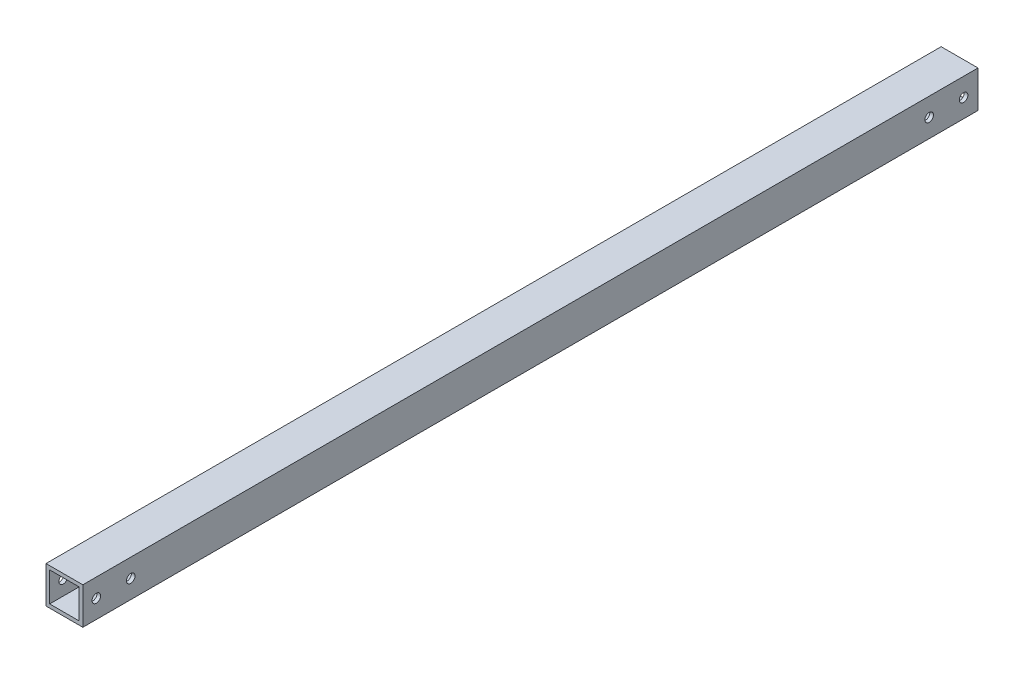
ISO-10303-21;
HEADER;
FILE_DESCRIPTION(('STEP AP214'),'2;1');
FILE_NAME('part.step','',(''),(''),'','','');
FILE_SCHEMA(('AUTOMOTIVE_DESIGN { 1 0 10303 214 1 1 1 1 }'));
ENDSEC;
DATA;
#1=APPLICATION_CONTEXT('core data for automotive mechanical design processes');
#2=APPLICATION_PROTOCOL_DEFINITION('international standard','automotive_design',2000,#1);
#3=PRODUCT_CONTEXT('',#1,'mechanical');
#4=PRODUCT('Part','Part','',(#3));
#5=PRODUCT_RELATED_PRODUCT_CATEGORY('part','',(#4));
#6=PRODUCT_DEFINITION_FORMATION('','',#4);
#7=PRODUCT_DEFINITION_CONTEXT('part definition',#1,'design');
#8=PRODUCT_DEFINITION('design','',#6,#7);
#9=PRODUCT_DEFINITION_SHAPE('','',#8);
#10=(LENGTH_UNIT() NAMED_UNIT(*) SI_UNIT(.MILLI.,.METRE.));
#11=(NAMED_UNIT(*) PLANE_ANGLE_UNIT() SI_UNIT($,.RADIAN.));
#12=(NAMED_UNIT(*) SI_UNIT($,.STERADIAN.) SOLID_ANGLE_UNIT());
#13=UNCERTAINTY_MEASURE_WITH_UNIT(LENGTH_MEASURE(1.E-05),#10,'distance_accuracy_value','');
#14=(GEOMETRIC_REPRESENTATION_CONTEXT(3) GLOBAL_UNCERTAINTY_ASSIGNED_CONTEXT((#13)) GLOBAL_UNIT_ASSIGNED_CONTEXT((#10,
#11,#12)) REPRESENTATION_CONTEXT('',''));
#15=CARTESIAN_POINT('',(0.,0.,0.));
#16=DIRECTION('',(0.,0.,1.));
#17=DIRECTION('',(1.,0.,0.));
#18=AXIS2_PLACEMENT_3D('',#15,#16,#17);
#19=CARTESIAN_POINT('',(0.,-30.,729.));
#20=DIRECTION('',(0.,0.,1.));
#21=DIRECTION('',(1.,0.,0.));
#22=AXIS2_PLACEMENT_3D('',#19,#20,#21);
#23=PLANE('',#22);
#24=DIRECTION('',(0.,-1.,0.));
#25=VECTOR('',#24,1.);
#26=CARTESIAN_POINT('',(0.,0.,729.));
#27=LINE('',#26,#25);
#28=CARTESIAN_POINT('',(0.,0.,729.));
#29=VERTEX_POINT('',#28);
#30=CARTESIAN_POINT('',(0.,-30.,729.));
#31=VERTEX_POINT('',#30);
#32=EDGE_CURVE('E139',#29,#31,#27,.T.);
#33=ORIENTED_EDGE('',*,*,#32,.T.);
#34=DIRECTION('',(1.,0.,0.));
#35=VECTOR('',#34,1.);
#36=CARTESIAN_POINT('',(0.,-30.,729.));
#37=LINE('',#36,#35);
#38=CARTESIAN_POINT('',(30.,-30.,729.));
#39=VERTEX_POINT('',#38);
#40=EDGE_CURVE('E142',#31,#39,#37,.T.);
#41=ORIENTED_EDGE('',*,*,#40,.T.);
#42=DIRECTION('',(0.,1.,0.));
#43=VECTOR('',#42,1.);
#44=CARTESIAN_POINT('',(30.,0.,729.));
#45=LINE('',#44,#43);
#46=CARTESIAN_POINT('',(30.,0.,729.));
#47=VERTEX_POINT('',#46);
#48=EDGE_CURVE('E145',#39,#47,#45,.T.);
#49=ORIENTED_EDGE('',*,*,#48,.T.);
#50=DIRECTION('',(-1.,0.,0.));
#51=VECTOR('',#50,1.);
#52=CARTESIAN_POINT('',(0.,0.,729.));
#53=LINE('',#52,#51);
#54=EDGE_CURVE('E147',#47,#29,#53,.T.);
#55=ORIENTED_EDGE('',*,*,#54,.T.);
#56=EDGE_LOOP('',(#33,#41,#49,#55));
#57=FACE_BOUND('',#56,.T.);
#58=DIRECTION('',(1.,0.,0.));
#59=VECTOR('',#58,1.);
#60=CARTESIAN_POINT('',(3.,-27.,729.));
#61=LINE('',#60,#59);
#62=CARTESIAN_POINT('',(3.,-27.,729.));
#63=VERTEX_POINT('',#62);
#64=CARTESIAN_POINT('',(27.,-27.,729.));
#65=VERTEX_POINT('',#64);
#66=EDGE_CURVE('E109',#63,#65,#61,.T.);
#67=ORIENTED_EDGE('',*,*,#66,.F.);
#68=DIRECTION('',(0.,-1.,0.));
#69=VECTOR('',#68,1.);
#70=CARTESIAN_POINT('',(3.,-3.,729.));
#71=LINE('',#70,#69);
#72=CARTESIAN_POINT('',(3.,-3.,729.));
#73=VERTEX_POINT('',#72);
#74=EDGE_CURVE('E101',#73,#63,#71,.T.);
#75=ORIENTED_EDGE('',*,*,#74,.F.);
#76=DIRECTION('',(-1.,0.,0.));
#77=VECTOR('',#76,1.);
#78=CARTESIAN_POINT('',(3.,-3.,729.));
#79=LINE('',#78,#77);
#80=CARTESIAN_POINT('',(27.,-3.,729.));
#81=VERTEX_POINT('',#80);
#82=EDGE_CURVE('E123',#81,#73,#79,.T.);
#83=ORIENTED_EDGE('',*,*,#82,.F.);
#84=DIRECTION('',(0.,1.,0.));
#85=VECTOR('',#84,1.);
#86=CARTESIAN_POINT('',(27.,-3.,729.));
#87=LINE('',#86,#85);
#88=EDGE_CURVE('E121',#65,#81,#87,.T.);
#89=ORIENTED_EDGE('',*,*,#88,.F.);
#90=EDGE_LOOP('',(#67,#75,#83,#89));
#91=FACE_BOUND('',#90,.T.);
#92=ADVANCED_FACE('F34',(#57,#91),#23,.T.);
#93=CARTESIAN_POINT('',(0.,-30.,0.));
#94=DIRECTION('',(0.,0.,1.));
#95=DIRECTION('',(1.,0.,0.));
#96=AXIS2_PLACEMENT_3D('',#93,#94,#95);
#97=PLANE('',#96);
#98=DIRECTION('',(0.,-1.,0.));
#99=VECTOR('',#98,1.);
#100=CARTESIAN_POINT('',(0.,0.,0.));
#101=LINE('',#100,#99);
#102=CARTESIAN_POINT('',(0.,0.,0.));
#103=VERTEX_POINT('',#102);
#104=CARTESIAN_POINT('',(0.,-30.,0.));
#105=VERTEX_POINT('',#104);
#106=EDGE_CURVE('E117',#103,#105,#101,.T.);
#107=ORIENTED_EDGE('',*,*,#106,.F.);
#108=DIRECTION('',(-1.,0.,0.));
#109=VECTOR('',#108,1.);
#110=CARTESIAN_POINT('',(0.,0.,0.));
#111=LINE('',#110,#109);
#112=CARTESIAN_POINT('',(30.,0.,0.));
#113=VERTEX_POINT('',#112);
#114=EDGE_CURVE('E143',#113,#103,#111,.T.);
#115=ORIENTED_EDGE('',*,*,#114,.F.);
#116=DIRECTION('',(0.,1.,0.));
#117=VECTOR('',#116,1.);
#118=CARTESIAN_POINT('',(30.,0.,0.));
#119=LINE('',#118,#117);
#120=CARTESIAN_POINT('',(30.,-30.,0.));
#121=VERTEX_POINT('',#120);
#122=EDGE_CURVE('E154',#121,#113,#119,.T.);
#123=ORIENTED_EDGE('',*,*,#122,.F.);
#124=DIRECTION('',(1.,0.,0.));
#125=VECTOR('',#124,1.);
#126=CARTESIAN_POINT('',(0.,-30.,0.));
#127=LINE('',#126,#125);
#128=EDGE_CURVE('E152',#105,#121,#127,.T.);
#129=ORIENTED_EDGE('',*,*,#128,.F.);
#130=EDGE_LOOP('',(#107,#115,#123,#129));
#131=FACE_BOUND('',#130,.T.);
#132=DIRECTION('',(0.,-1.,0.));
#133=VECTOR('',#132,1.);
#134=CARTESIAN_POINT('',(3.,-3.,0.));
#135=LINE('',#134,#133);
#136=CARTESIAN_POINT('',(3.,-3.,0.));
#137=VERTEX_POINT('',#136);
#138=CARTESIAN_POINT('',(3.,-27.,0.));
#139=VERTEX_POINT('',#138);
#140=EDGE_CURVE('E59',#137,#139,#135,.T.);
#141=ORIENTED_EDGE('',*,*,#140,.T.);
#142=DIRECTION('',(1.,0.,0.));
#143=VECTOR('',#142,1.);
#144=CARTESIAN_POINT('',(3.,-27.,0.));
#145=LINE('',#144,#143);
#146=CARTESIAN_POINT('',(27.,-27.,0.));
#147=VERTEX_POINT('',#146);
#148=EDGE_CURVE('E116',#139,#147,#145,.T.);
#149=ORIENTED_EDGE('',*,*,#148,.T.);
#150=DIRECTION('',(0.,1.,0.));
#151=VECTOR('',#150,1.);
#152=CARTESIAN_POINT('',(27.,-3.,0.));
#153=LINE('',#152,#151);
#154=CARTESIAN_POINT('',(27.,-3.,0.));
#155=VERTEX_POINT('',#154);
#156=EDGE_CURVE('E131',#147,#155,#153,.T.);
#157=ORIENTED_EDGE('',*,*,#156,.T.);
#158=DIRECTION('',(-1.,0.,0.));
#159=VECTOR('',#158,1.);
#160=CARTESIAN_POINT('',(3.,-3.,0.));
#161=LINE('',#160,#159);
#162=EDGE_CURVE('E110',#155,#137,#161,.T.);
#163=ORIENTED_EDGE('',*,*,#162,.T.);
#164=EDGE_LOOP('',(#141,#149,#157,#163));
#165=FACE_BOUND('',#164,.T.);
#166=ADVANCED_FACE('F227',(#131,#165),#97,.F.);
#167=CARTESIAN_POINT('',(0.,0.,729.));
#168=DIRECTION('',(1.,0.,0.));
#169=DIRECTION('',(0.,1.,0.));
#170=AXIS2_PLACEMENT_3D('',#167,#168,#169);
#171=PLANE('',#170);
#172=CARTESIAN_POINT('',(0.,-14.9999999999987,11.7500000000004));
#173=DIRECTION('',(1.,0.,0.));
#174=DIRECTION('',(0.,0.,-1.));
#175=AXIS2_PLACEMENT_3D('',#172,#173,#174);
#176=CIRCLE('',#175,3.49999999999999);
#177=CARTESIAN_POINT('',(0.,-14.9999999999987,8.25000000000038));
#178=VERTEX_POINT('',#177);
#179=EDGE_CURVE('E198',#178,#178,#176,.T.);
#180=ORIENTED_EDGE('',*,*,#179,.T.);
#181=EDGE_LOOP('',(#180));
#182=FACE_BOUND('',#181,.T.);
#183=CARTESIAN_POINT('',(0.,-14.9999999999987,39.7500000000003));
#184=DIRECTION('',(1.,0.,0.));
#185=DIRECTION('',(0.,0.,-1.));
#186=AXIS2_PLACEMENT_3D('',#183,#184,#185);
#187=CIRCLE('',#186,3.49999999999999);
#188=CARTESIAN_POINT('',(0.,-14.9999999999987,36.2500000000003));
#189=VERTEX_POINT('',#188);
#190=EDGE_CURVE('E186',#189,#189,#187,.T.);
#191=ORIENTED_EDGE('',*,*,#190,.T.);
#192=EDGE_LOOP('',(#191));
#193=FACE_BOUND('',#192,.T.);
#194=CARTESIAN_POINT('',(0.,-14.9999999999987,718.));
#195=DIRECTION('',(1.,0.,0.));
#196=DIRECTION('',(0.,0.,-1.));
#197=AXIS2_PLACEMENT_3D('',#194,#195,#196);
#198=CIRCLE('',#197,3.49999999999999);
#199=CARTESIAN_POINT('',(0.,-14.9999999999987,714.5));
#200=VERTEX_POINT('',#199);
#201=EDGE_CURVE('E180',#200,#200,#198,.T.);
#202=ORIENTED_EDGE('',*,*,#201,.T.);
#203=EDGE_LOOP('',(#202));
#204=FACE_BOUND('',#203,.T.);
#205=CARTESIAN_POINT('',(0.,-14.9999999999987,690.));
#206=DIRECTION('',(1.,0.,0.));
#207=DIRECTION('',(0.,0.,-1.));
#208=AXIS2_PLACEMENT_3D('',#205,#206,#207);
#209=CIRCLE('',#208,3.49999999999999);
#210=CARTESIAN_POINT('',(0.,-14.9999999999987,686.5));
#211=VERTEX_POINT('',#210);
#212=EDGE_CURVE('E165',#211,#211,#209,.T.);
#213=ORIENTED_EDGE('',*,*,#212,.T.);
#214=EDGE_LOOP('',(#213));
#215=FACE_BOUND('',#214,.T.);
#216=ORIENTED_EDGE('',*,*,#106,.T.);
#217=DIRECTION('',(0.,0.,-1.));
#218=VECTOR('',#217,1.);
#219=CARTESIAN_POINT('',(0.,-30.,729.));
#220=LINE('',#219,#218);
#221=EDGE_CURVE('E11',#31,#105,#220,.T.);
#222=ORIENTED_EDGE('',*,*,#221,.F.);
#223=ORIENTED_EDGE('',*,*,#32,.F.);
#224=DIRECTION('',(0.,0.,-1.));
#225=VECTOR('',#224,1.);
#226=CARTESIAN_POINT('',(0.,0.,729.));
#227=LINE('',#226,#225);
#228=EDGE_CURVE('E149',#29,#103,#227,.T.);
#229=ORIENTED_EDGE('',*,*,#228,.T.);
#230=EDGE_LOOP('',(#216,#222,#223,#229));
#231=FACE_BOUND('',#230,.T.);
#232=ADVANCED_FACE('F36',(#182,#193,#204,#215,#231),#171,.F.);
#233=CARTESIAN_POINT('',(0.,-30.,729.));
#234=DIRECTION('',(0.,1.,0.));
#235=DIRECTION('',(0.,0.,1.));
#236=AXIS2_PLACEMENT_3D('',#233,#234,#235);
#237=PLANE('',#236);
#238=ORIENTED_EDGE('',*,*,#128,.T.);
#239=DIRECTION('',(0.,0.,-1.));
#240=VECTOR('',#239,1.);
#241=CARTESIAN_POINT('',(30.,-30.,729.));
#242=LINE('',#241,#240);
#243=EDGE_CURVE('E43',#39,#121,#242,.T.);
#244=ORIENTED_EDGE('',*,*,#243,.F.);
#245=ORIENTED_EDGE('',*,*,#40,.F.);
#246=ORIENTED_EDGE('',*,*,#221,.T.);
#247=EDGE_LOOP('',(#238,#244,#245,#246));
#248=FACE_BOUND('',#247,.T.);
#249=ADVANCED_FACE('F254',(#248),#237,.F.);
#250=CARTESIAN_POINT('',(30.,0.,729.));
#251=DIRECTION('',(-1.,0.,0.));
#252=DIRECTION('',(0.,-1.,0.));
#253=AXIS2_PLACEMENT_3D('',#250,#251,#252);
#254=PLANE('',#253);
#255=CARTESIAN_POINT('',(30.,-14.9999999999987,39.7500000000003));
#256=DIRECTION('',(1.,0.,0.));
#257=DIRECTION('',(0.,0.,-1.));
#258=AXIS2_PLACEMENT_3D('',#255,#256,#257);
#259=CIRCLE('',#258,3.5);
#260=CARTESIAN_POINT('',(30.,-14.9999999999987,36.2500000000003));
#261=VERTEX_POINT('',#260);
#262=EDGE_CURVE('E204',#261,#261,#259,.T.);
#263=ORIENTED_EDGE('',*,*,#262,.F.);
#264=EDGE_LOOP('',(#263));
#265=FACE_BOUND('',#264,.T.);
#266=CARTESIAN_POINT('',(30.,-14.9999999999987,11.7500000000004));
#267=DIRECTION('',(1.,0.,0.));
#268=DIRECTION('',(0.,0.,-1.));
#269=AXIS2_PLACEMENT_3D('',#266,#267,#268);
#270=CIRCLE('',#269,3.5);
#271=CARTESIAN_POINT('',(30.,-14.9999999999987,8.25000000000037));
#272=VERTEX_POINT('',#271);
#273=EDGE_CURVE('E192',#272,#272,#270,.T.);
#274=ORIENTED_EDGE('',*,*,#273,.F.);
#275=EDGE_LOOP('',(#274));
#276=FACE_BOUND('',#275,.T.);
#277=CARTESIAN_POINT('',(30.,-14.9999999999987,718.));
#278=DIRECTION('',(1.,0.,0.));
#279=DIRECTION('',(0.,0.,-1.));
#280=AXIS2_PLACEMENT_3D('',#277,#278,#279);
#281=CIRCLE('',#280,3.5);
#282=CARTESIAN_POINT('',(30.,-14.9999999999987,714.5));
#283=VERTEX_POINT('',#282);
#284=EDGE_CURVE('E183',#283,#283,#281,.T.);
#285=ORIENTED_EDGE('',*,*,#284,.F.);
#286=EDGE_LOOP('',(#285));
#287=FACE_BOUND('',#286,.T.);
#288=CARTESIAN_POINT('',(30.,-14.9999999999987,690.));
#289=DIRECTION('',(1.,0.,0.));
#290=DIRECTION('',(0.,0.,-1.));
#291=AXIS2_PLACEMENT_3D('',#288,#289,#290);
#292=CIRCLE('',#291,3.5);
#293=CARTESIAN_POINT('',(30.,-14.9999999999987,686.5));
#294=VERTEX_POINT('',#293);
#295=EDGE_CURVE('E170',#294,#294,#292,.T.);
#296=ORIENTED_EDGE('',*,*,#295,.F.);
#297=EDGE_LOOP('',(#296));
#298=FACE_BOUND('',#297,.T.);
#299=ORIENTED_EDGE('',*,*,#122,.T.);
#300=DIRECTION('',(0.,0.,-1.));
#301=VECTOR('',#300,1.);
#302=CARTESIAN_POINT('',(30.,0.,729.));
#303=LINE('',#302,#301);
#304=EDGE_CURVE('E159',#47,#113,#303,.T.);
#305=ORIENTED_EDGE('',*,*,#304,.F.);
#306=ORIENTED_EDGE('',*,*,#48,.F.);
#307=ORIENTED_EDGE('',*,*,#243,.T.);
#308=EDGE_LOOP('',(#299,#305,#306,#307));
#309=FACE_BOUND('',#308,.T.);
#310=ADVANCED_FACE('F251',(#265,#276,#287,#298,#309),#254,.F.);
#311=CARTESIAN_POINT('',(0.,0.,729.));
#312=DIRECTION('',(0.,-1.,0.));
#313=DIRECTION('',(0.,0.,-1.));
#314=AXIS2_PLACEMENT_3D('',#311,#312,#313);
#315=PLANE('',#314);
#316=ORIENTED_EDGE('',*,*,#114,.T.);
#317=ORIENTED_EDGE('',*,*,#228,.F.);
#318=ORIENTED_EDGE('',*,*,#54,.F.);
#319=ORIENTED_EDGE('',*,*,#304,.T.);
#320=EDGE_LOOP('',(#316,#317,#318,#319));
#321=FACE_BOUND('',#320,.T.);
#322=ADVANCED_FACE('F248',(#321),#315,.F.);
#323=CARTESIAN_POINT('',(3.,-3.,729.));
#324=DIRECTION('',(1.,0.,0.));
#325=DIRECTION('',(0.,1.,0.));
#326=AXIS2_PLACEMENT_3D('',#323,#324,#325);
#327=PLANE('',#326);
#328=CARTESIAN_POINT('',(3.,-14.9999999999987,11.7500000000004));
#329=DIRECTION('',(1.,0.,0.));
#330=DIRECTION('',(0.,1.,0.));
#331=AXIS2_PLACEMENT_3D('',#328,#329,#330);
#332=CIRCLE('',#331,3.49999999999999);
#333=CARTESIAN_POINT('',(3.,-11.4999999999987,11.7500000000004));
#334=VERTEX_POINT('',#333);
#335=EDGE_CURVE('E201',#334,#334,#332,.T.);
#336=ORIENTED_EDGE('',*,*,#335,.F.);
#337=EDGE_LOOP('',(#336));
#338=FACE_BOUND('',#337,.T.);
#339=CARTESIAN_POINT('',(3.,-14.9999999999987,39.7500000000003));
#340=DIRECTION('',(1.,0.,0.));
#341=DIRECTION('',(0.,1.,0.));
#342=AXIS2_PLACEMENT_3D('',#339,#340,#341);
#343=CIRCLE('',#342,3.49999999999999);
#344=CARTESIAN_POINT('',(3.,-11.4999999999987,39.7500000000003));
#345=VERTEX_POINT('',#344);
#346=EDGE_CURVE('E189',#345,#345,#343,.T.);
#347=ORIENTED_EDGE('',*,*,#346,.F.);
#348=EDGE_LOOP('',(#347));
#349=FACE_BOUND('',#348,.T.);
#350=CARTESIAN_POINT('',(3.,-14.9999999999987,718.));
#351=DIRECTION('',(1.,0.,0.));
#352=DIRECTION('',(0.,1.,0.));
#353=AXIS2_PLACEMENT_3D('',#350,#351,#352);
#354=CIRCLE('',#353,3.49999999999999);
#355=CARTESIAN_POINT('',(3.,-11.4999999999987,718.));
#356=VERTEX_POINT('',#355);
#357=EDGE_CURVE('E175',#356,#356,#354,.T.);
#358=ORIENTED_EDGE('',*,*,#357,.F.);
#359=EDGE_LOOP('',(#358));
#360=FACE_BOUND('',#359,.T.);
#361=CARTESIAN_POINT('',(3.,-14.9999999999987,690.));
#362=DIRECTION('',(1.,0.,0.));
#363=DIRECTION('',(0.,1.,0.));
#364=AXIS2_PLACEMENT_3D('',#361,#362,#363);
#365=CIRCLE('',#364,3.49999999999999);
#366=CARTESIAN_POINT('',(3.,-11.4999999999987,690.));
#367=VERTEX_POINT('',#366);
#368=EDGE_CURVE('E129',#367,#367,#365,.T.);
#369=ORIENTED_EDGE('',*,*,#368,.F.);
#370=EDGE_LOOP('',(#369));
#371=FACE_BOUND('',#370,.T.);
#372=ORIENTED_EDGE('',*,*,#140,.F.);
#373=DIRECTION('',(0.,0.,-1.));
#374=VECTOR('',#373,1.);
#375=CARTESIAN_POINT('',(3.,-3.,729.));
#376=LINE('',#375,#374);
#377=EDGE_CURVE('E105',#73,#137,#376,.T.);
#378=ORIENTED_EDGE('',*,*,#377,.F.);
#379=ORIENTED_EDGE('',*,*,#74,.T.);
#380=DIRECTION('',(0.,0.,-1.));
#381=VECTOR('',#380,1.);
#382=CARTESIAN_POINT('',(3.,-27.,729.));
#383=LINE('',#382,#381);
#384=EDGE_CURVE('E104',#63,#139,#383,.T.);
#385=ORIENTED_EDGE('',*,*,#384,.T.);
#386=EDGE_LOOP('',(#372,#378,#379,#385));
#387=FACE_BOUND('',#386,.T.);
#388=ADVANCED_FACE('F103',(#338,#349,#360,#371,#387),#327,.T.);
#389=CARTESIAN_POINT('',(3.,-27.,729.));
#390=DIRECTION('',(0.,1.,0.));
#391=DIRECTION('',(0.,0.,1.));
#392=AXIS2_PLACEMENT_3D('',#389,#390,#391);
#393=PLANE('',#392);
#394=ORIENTED_EDGE('',*,*,#148,.F.);
#395=ORIENTED_EDGE('',*,*,#384,.F.);
#396=ORIENTED_EDGE('',*,*,#66,.T.);
#397=DIRECTION('',(0.,0.,-1.));
#398=VECTOR('',#397,1.);
#399=CARTESIAN_POINT('',(27.,-27.,729.));
#400=LINE('',#399,#398);
#401=EDGE_CURVE('E118',#65,#147,#400,.T.);
#402=ORIENTED_EDGE('',*,*,#401,.T.);
#403=EDGE_LOOP('',(#394,#395,#396,#402));
#404=FACE_BOUND('',#403,.T.);
#405=ADVANCED_FACE('F113',(#404),#393,.T.);
#406=CARTESIAN_POINT('',(27.,-3.,729.));
#407=DIRECTION('',(-1.,0.,0.));
#408=DIRECTION('',(0.,-1.,0.));
#409=AXIS2_PLACEMENT_3D('',#406,#407,#408);
#410=PLANE('',#409);
#411=CARTESIAN_POINT('',(27.,-14.9999999999987,39.7500000000003));
#412=DIRECTION('',(-1.,0.,0.));
#413=DIRECTION('',(0.,-1.,0.));
#414=AXIS2_PLACEMENT_3D('',#411,#412,#413);
#415=CIRCLE('',#414,3.49999999999999);
#416=CARTESIAN_POINT('',(27.,-18.4999999999987,39.7500000000003));
#417=VERTEX_POINT('',#416);
#418=EDGE_CURVE('E207',#417,#417,#415,.T.);
#419=ORIENTED_EDGE('',*,*,#418,.F.);
#420=EDGE_LOOP('',(#419));
#421=FACE_BOUND('',#420,.T.);
#422=CARTESIAN_POINT('',(27.,-14.9999999999987,11.7500000000004));
#423=DIRECTION('',(-1.,0.,0.));
#424=DIRECTION('',(0.,-1.,0.));
#425=AXIS2_PLACEMENT_3D('',#422,#423,#424);
#426=CIRCLE('',#425,3.49999999999999);
#427=CARTESIAN_POINT('',(27.,-18.4999999999987,11.7500000000004));
#428=VERTEX_POINT('',#427);
#429=EDGE_CURVE('E195',#428,#428,#426,.T.);
#430=ORIENTED_EDGE('',*,*,#429,.F.);
#431=EDGE_LOOP('',(#430));
#432=FACE_BOUND('',#431,.T.);
#433=CARTESIAN_POINT('',(27.,-14.9999999999987,718.));
#434=DIRECTION('',(-1.,0.,0.));
#435=DIRECTION('',(0.,-1.,0.));
#436=AXIS2_PLACEMENT_3D('',#433,#434,#435);
#437=CIRCLE('',#436,3.49999999999999);
#438=CARTESIAN_POINT('',(27.,-18.4999999999987,718.));
#439=VERTEX_POINT('',#438);
#440=EDGE_CURVE('E38',#439,#439,#437,.T.);
#441=ORIENTED_EDGE('',*,*,#440,.F.);
#442=EDGE_LOOP('',(#441));
#443=FACE_BOUND('',#442,.T.);
#444=CARTESIAN_POINT('',(27.,-14.9999999999987,690.));
#445=DIRECTION('',(-1.,0.,0.));
#446=DIRECTION('',(0.,-1.,0.));
#447=AXIS2_PLACEMENT_3D('',#444,#445,#446);
#448=CIRCLE('',#447,3.49999999999999);
#449=CARTESIAN_POINT('',(27.,-18.4999999999987,690.));
#450=VERTEX_POINT('',#449);
#451=EDGE_CURVE('E163',#450,#450,#448,.T.);
#452=ORIENTED_EDGE('',*,*,#451,.F.);
#453=EDGE_LOOP('',(#452));
#454=FACE_BOUND('',#453,.T.);
#455=ORIENTED_EDGE('',*,*,#156,.F.);
#456=ORIENTED_EDGE('',*,*,#401,.F.);
#457=ORIENTED_EDGE('',*,*,#88,.T.);
#458=DIRECTION('',(0.,0.,-1.));
#459=VECTOR('',#458,1.);
#460=CARTESIAN_POINT('',(27.,-3.,729.));
#461=LINE('',#460,#459);
#462=EDGE_CURVE('E51',#81,#155,#461,.T.);
#463=ORIENTED_EDGE('',*,*,#462,.T.);
#464=EDGE_LOOP('',(#455,#456,#457,#463));
#465=FACE_BOUND('',#464,.T.);
#466=ADVANCED_FACE('F214',(#421,#432,#443,#454,#465),#410,.T.);
#467=CARTESIAN_POINT('',(3.,-3.,729.));
#468=DIRECTION('',(0.,-1.,0.));
#469=DIRECTION('',(0.,0.,-1.));
#470=AXIS2_PLACEMENT_3D('',#467,#468,#469);
#471=PLANE('',#470);
#472=ORIENTED_EDGE('',*,*,#162,.F.);
#473=ORIENTED_EDGE('',*,*,#462,.F.);
#474=ORIENTED_EDGE('',*,*,#82,.T.);
#475=ORIENTED_EDGE('',*,*,#377,.T.);
#476=EDGE_LOOP('',(#472,#473,#474,#475));
#477=FACE_BOUND('',#476,.T.);
#478=ADVANCED_FACE('F217',(#477),#471,.T.);
#479=CARTESIAN_POINT('',(30.,-14.9999999999987,690.));
#480=DIRECTION('',(1.,0.,0.));
#481=DIRECTION('',(0.,0.,-1.));
#482=AXIS2_PLACEMENT_3D('',#479,#480,#481);
#483=CYLINDRICAL_SURFACE('',#482,3.49999999999999);
#484=ORIENTED_EDGE('',*,*,#451,.T.);
#485=EDGE_LOOP('',(#484));
#486=FACE_BOUND('',#485,.T.);
#487=ORIENTED_EDGE('',*,*,#295,.T.);
#488=EDGE_LOOP('',(#487));
#489=FACE_BOUND('',#488,.T.);
#490=ADVANCED_FACE('F229',(#486,#489),#483,.F.);
#491=ORIENTED_EDGE('',*,*,#368,.T.);
#492=EDGE_LOOP('',(#491));
#493=FACE_BOUND('',#492,.T.);
#494=ORIENTED_EDGE('',*,*,#212,.F.);
#495=EDGE_LOOP('',(#494));
#496=FACE_BOUND('',#495,.T.);
#497=ADVANCED_FACE('F235',(#493,#496),#483,.F.);
#498=CARTESIAN_POINT('',(30.,-14.9999999999987,718.));
#499=DIRECTION('',(1.,0.,0.));
#500=DIRECTION('',(0.,0.,-1.));
#501=AXIS2_PLACEMENT_3D('',#498,#499,#500);
#502=CYLINDRICAL_SURFACE('',#501,3.49999999999999);
#503=ORIENTED_EDGE('',*,*,#440,.T.);
#504=EDGE_LOOP('',(#503));
#505=FACE_BOUND('',#504,.T.);
#506=ORIENTED_EDGE('',*,*,#284,.T.);
#507=EDGE_LOOP('',(#506));
#508=FACE_BOUND('',#507,.T.);
#509=ADVANCED_FACE('F287',(#505,#508),#502,.F.);
#510=ORIENTED_EDGE('',*,*,#357,.T.);
#511=EDGE_LOOP('',(#510));
#512=FACE_BOUND('',#511,.T.);
#513=ORIENTED_EDGE('',*,*,#201,.F.);
#514=EDGE_LOOP('',(#513));
#515=FACE_BOUND('',#514,.T.);
#516=ADVANCED_FACE('F284',(#512,#515),#502,.F.);
#517=CARTESIAN_POINT('',(30.,-14.9999999999987,39.7500000000003));
#518=DIRECTION('',(1.,0.,0.));
#519=DIRECTION('',(0.,0.,-1.));
#520=AXIS2_PLACEMENT_3D('',#517,#518,#519);
#521=CYLINDRICAL_SURFACE('',#520,3.49999999999999);
#522=ORIENTED_EDGE('',*,*,#346,.T.);
#523=EDGE_LOOP('',(#522));
#524=FACE_BOUND('',#523,.T.);
#525=ORIENTED_EDGE('',*,*,#190,.F.);
#526=EDGE_LOOP('',(#525));
#527=FACE_BOUND('',#526,.T.);
#528=ADVANCED_FACE('F286',(#524,#527),#521,.F.);
#529=CARTESIAN_POINT('',(30.,-14.9999999999987,11.7500000000004));
#530=DIRECTION('',(1.,0.,0.));
#531=DIRECTION('',(0.,0.,-1.));
#532=AXIS2_PLACEMENT_3D('',#529,#530,#531);
#533=CYLINDRICAL_SURFACE('',#532,3.49999999999999);
#534=ORIENTED_EDGE('',*,*,#429,.T.);
#535=EDGE_LOOP('',(#534));
#536=FACE_BOUND('',#535,.T.);
#537=ORIENTED_EDGE('',*,*,#273,.T.);
#538=EDGE_LOOP('',(#537));
#539=FACE_BOUND('',#538,.T.);
#540=ADVANCED_FACE('F293',(#536,#539),#533,.F.);
#541=CARTESIAN_POINT('',(30.,-14.9999999999987,11.7500000000004));
#542=DIRECTION('',(1.,0.,0.));
#543=DIRECTION('',(0.,0.,-1.));
#544=AXIS2_PLACEMENT_3D('',#541,#542,#543);
#545=CYLINDRICAL_SURFACE('',#544,3.49999999999999);
#546=ORIENTED_EDGE('',*,*,#335,.T.);
#547=EDGE_LOOP('',(#546));
#548=FACE_BOUND('',#547,.T.);
#549=ORIENTED_EDGE('',*,*,#179,.F.);
#550=EDGE_LOOP('',(#549));
#551=FACE_BOUND('',#550,.T.);
#552=ADVANCED_FACE('F300',(#548,#551),#545,.F.);
#553=CARTESIAN_POINT('',(30.,-14.9999999999987,39.7500000000003));
#554=DIRECTION('',(1.,0.,0.));
#555=DIRECTION('',(0.,0.,-1.));
#556=AXIS2_PLACEMENT_3D('',#553,#554,#555);
#557=CYLINDRICAL_SURFACE('',#556,3.49999999999999);
#558=ORIENTED_EDGE('',*,*,#418,.T.);
#559=EDGE_LOOP('',(#558));
#560=FACE_BOUND('',#559,.T.);
#561=ORIENTED_EDGE('',*,*,#262,.T.);
#562=EDGE_LOOP('',(#561));
#563=FACE_BOUND('',#562,.T.);
#564=ADVANCED_FACE('F211',(#560,#563),#557,.F.);
#565=CLOSED_SHELL('',(#92,#166,#232,#249,#310,#322,#388,#405,#466,#478,#490,#497,#509,#516,#528,
#540,#552,#564));
#566=MANIFOLD_SOLID_BREP('B2',#565);
#567=ADVANCED_BREP_SHAPE_REPRESENTATION('',(#18,#566),#14);
#568=SHAPE_DEFINITION_REPRESENTATION(#9,#567);
ENDSEC;
END-ISO-10303-21;
